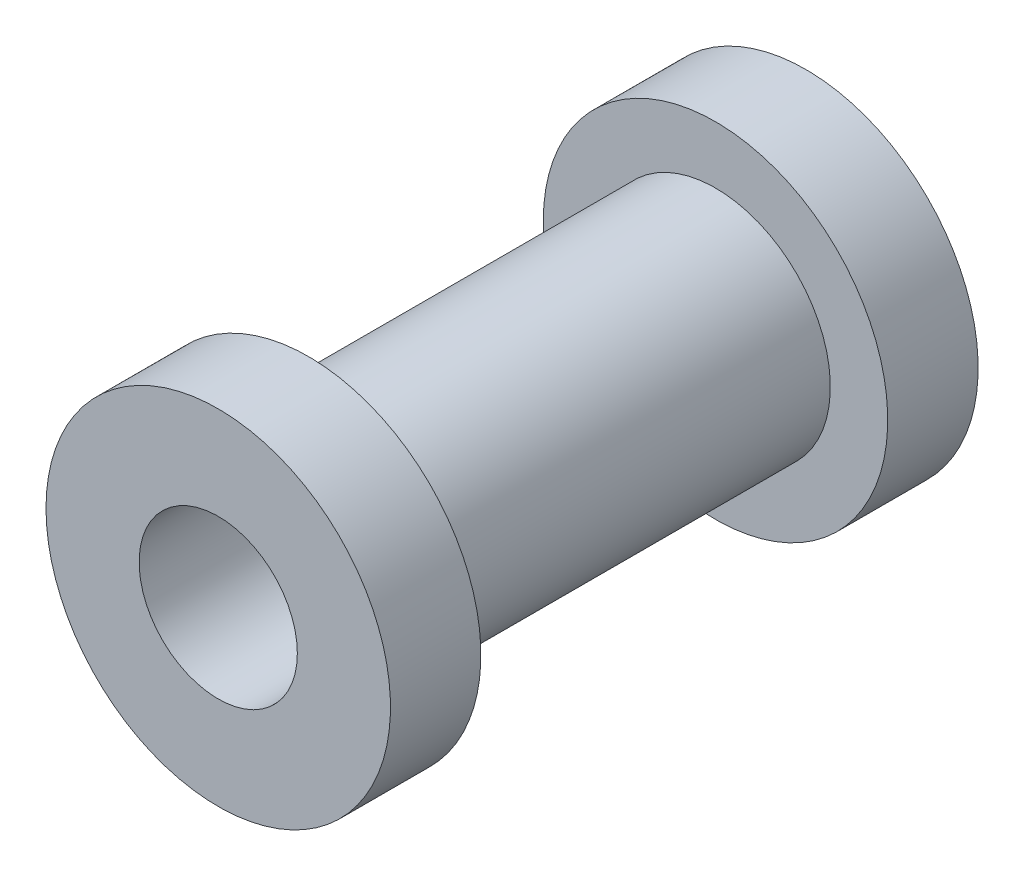
ISO-10303-21;
HEADER;
FILE_DESCRIPTION(('STEP AP214'),'2;1');
FILE_NAME('part.step','',(''),(''),'','','');
FILE_SCHEMA(('AUTOMOTIVE_DESIGN { 1 0 10303 214 1 1 1 1 }'));
ENDSEC;
DATA;
#1=APPLICATION_CONTEXT('core data for automotive mechanical design processes');
#2=APPLICATION_PROTOCOL_DEFINITION('international standard','automotive_design',2000,#1);
#3=PRODUCT_CONTEXT('',#1,'mechanical');
#4=PRODUCT('Part','Part','',(#3));
#5=PRODUCT_RELATED_PRODUCT_CATEGORY('part','',(#4));
#6=PRODUCT_DEFINITION_FORMATION('','',#4);
#7=PRODUCT_DEFINITION_CONTEXT('part definition',#1,'design');
#8=PRODUCT_DEFINITION('design','',#6,#7);
#9=PRODUCT_DEFINITION_SHAPE('','',#8);
#10=(LENGTH_UNIT() NAMED_UNIT(*) SI_UNIT(.MILLI.,.METRE.));
#11=(NAMED_UNIT(*) PLANE_ANGLE_UNIT() SI_UNIT($,.RADIAN.));
#12=(NAMED_UNIT(*) SI_UNIT($,.STERADIAN.) SOLID_ANGLE_UNIT());
#13=UNCERTAINTY_MEASURE_WITH_UNIT(LENGTH_MEASURE(1.E-05),#10,'distance_accuracy_value','');
#14=(GEOMETRIC_REPRESENTATION_CONTEXT(3) GLOBAL_UNCERTAINTY_ASSIGNED_CONTEXT((#13)) GLOBAL_UNIT_ASSIGNED_CONTEXT((#10,
#11,#12)) REPRESENTATION_CONTEXT('',''));
#15=CARTESIAN_POINT('',(0.,0.,0.));
#16=DIRECTION('',(0.,0.,1.));
#17=DIRECTION('',(1.,0.,0.));
#18=AXIS2_PLACEMENT_3D('',#15,#16,#17);
#19=CARTESIAN_POINT('',(0.,0.,65.));
#20=DIRECTION('',(0.,0.,-1.));
#21=DIRECTION('',(-1.,0.,0.));
#22=AXIS2_PLACEMENT_3D('',#19,#20,#21);
#23=CYLINDRICAL_SURFACE('',#22,25.4);
#24=CARTESIAN_POINT('',(0.,0.,-45.));
#25=DIRECTION('',(0.,0.,-1.));
#26=DIRECTION('',(-1.,0.,0.));
#27=AXIS2_PLACEMENT_3D('',#24,#25,#26);
#28=CIRCLE('',#27,25.4);
#29=CARTESIAN_POINT('',(-25.4,0.,-45.));
#30=VERTEX_POINT('',#29);
#31=EDGE_CURVE('E43',#30,#30,#28,.T.);
#32=ORIENTED_EDGE('',*,*,#31,.F.);
#33=EDGE_LOOP('',(#32));
#34=FACE_BOUND('',#33,.T.);
#35=CARTESIAN_POINT('',(0.,0.,45.));
#36=DIRECTION('',(0.,0.,1.));
#37=DIRECTION('',(1.,0.,0.));
#38=AXIS2_PLACEMENT_3D('',#35,#36,#37);
#39=CIRCLE('',#38,25.4);
#40=CARTESIAN_POINT('',(25.4,0.,45.));
#41=VERTEX_POINT('',#40);
#42=EDGE_CURVE('E10',#41,#41,#39,.T.);
#43=ORIENTED_EDGE('',*,*,#42,.F.);
#44=EDGE_LOOP('',(#43));
#45=FACE_BOUND('',#44,.T.);
#46=ADVANCED_FACE('F37',(#34,#45),#23,.T.);
#47=CARTESIAN_POINT('',(0.,0.,65.));
#48=DIRECTION('',(0.,0.,1.));
#49=DIRECTION('',(1.,0.,0.));
#50=AXIS2_PLACEMENT_3D('',#47,#48,#49);
#51=PLANE('',#50);
#52=CARTESIAN_POINT('',(0.,0.,65.));
#53=DIRECTION('',(0.,0.,1.));
#54=DIRECTION('',(1.,0.,0.));
#55=AXIS2_PLACEMENT_3D('',#52,#53,#54);
#56=CIRCLE('',#55,17.5);
#57=CARTESIAN_POINT('',(17.5,0.,65.));
#58=VERTEX_POINT('',#57);
#59=EDGE_CURVE('E47',#58,#58,#56,.T.);
#60=ORIENTED_EDGE('',*,*,#59,.F.);
#61=EDGE_LOOP('',(#60));
#62=FACE_BOUND('',#61,.T.);
#63=CARTESIAN_POINT('',(0.,0.,65.));
#64=DIRECTION('',(0.,0.,-1.));
#65=DIRECTION('',(-1.,0.,0.));
#66=AXIS2_PLACEMENT_3D('',#63,#64,#65);
#67=CIRCLE('',#66,38.1);
#68=CARTESIAN_POINT('',(-38.1,0.,65.));
#69=VERTEX_POINT('',#68);
#70=EDGE_CURVE('E63',#69,#69,#67,.T.);
#71=ORIENTED_EDGE('',*,*,#70,.F.);
#72=EDGE_LOOP('',(#71));
#73=FACE_BOUND('',#72,.T.);
#74=ADVANCED_FACE('F77',(#62,#73),#51,.T.);
#75=CARTESIAN_POINT('',(0.,0.,-65.));
#76=DIRECTION('',(0.,0.,1.));
#77=DIRECTION('',(1.,0.,0.));
#78=AXIS2_PLACEMENT_3D('',#75,#76,#77);
#79=PLANE('',#78);
#80=CARTESIAN_POINT('',(0.,0.,-65.));
#81=DIRECTION('',(0.,0.,1.));
#82=DIRECTION('',(1.,0.,0.));
#83=AXIS2_PLACEMENT_3D('',#80,#81,#82);
#84=CIRCLE('',#83,17.5);
#85=CARTESIAN_POINT('',(17.5,0.,-65.));
#86=VERTEX_POINT('',#85);
#87=EDGE_CURVE('E51',#86,#86,#84,.T.);
#88=ORIENTED_EDGE('',*,*,#87,.T.);
#89=EDGE_LOOP('',(#88));
#90=FACE_BOUND('',#89,.T.);
#91=CARTESIAN_POINT('',(0.,0.,-65.));
#92=DIRECTION('',(0.,0.,-1.));
#93=DIRECTION('',(-1.,0.,0.));
#94=AXIS2_PLACEMENT_3D('',#91,#92,#93);
#95=CIRCLE('',#94,38.1);
#96=CARTESIAN_POINT('',(-38.1,0.,-65.));
#97=VERTEX_POINT('',#96);
#98=EDGE_CURVE('E57',#97,#97,#95,.T.);
#99=ORIENTED_EDGE('',*,*,#98,.T.);
#100=EDGE_LOOP('',(#99));
#101=FACE_BOUND('',#100,.T.);
#102=ADVANCED_FACE('F79',(#90,#101),#79,.F.);
#103=CARTESIAN_POINT('',(0.,0.,65.));
#104=DIRECTION('',(0.,0.,-1.));
#105=DIRECTION('',(-1.,0.,0.));
#106=AXIS2_PLACEMENT_3D('',#103,#104,#105);
#107=CYLINDRICAL_SURFACE('',#106,17.5);
#108=ORIENTED_EDGE('',*,*,#59,.T.);
#109=EDGE_LOOP('',(#108));
#110=FACE_BOUND('',#109,.T.);
#111=ORIENTED_EDGE('',*,*,#87,.F.);
#112=EDGE_LOOP('',(#111));
#113=FACE_BOUND('',#112,.T.);
#114=ADVANCED_FACE('F86',(#110,#113),#107,.F.);
#115=CARTESIAN_POINT('',(0.,0.,-45.));
#116=DIRECTION('',(0.,0.,-1.));
#117=DIRECTION('',(-1.,0.,0.));
#118=AXIS2_PLACEMENT_3D('',#115,#116,#117);
#119=CYLINDRICAL_SURFACE('',#118,38.1);
#120=CARTESIAN_POINT('',(0.,0.,-45.));
#121=DIRECTION('',(0.,0.,-1.));
#122=DIRECTION('',(-1.,0.,0.));
#123=AXIS2_PLACEMENT_3D('',#120,#121,#122);
#124=CIRCLE('',#123,38.1);
#125=CARTESIAN_POINT('',(-38.1,0.,-45.));
#126=VERTEX_POINT('',#125);
#127=EDGE_CURVE('E55',#126,#126,#124,.T.);
#128=ORIENTED_EDGE('',*,*,#127,.T.);
#129=EDGE_LOOP('',(#128));
#130=FACE_BOUND('',#129,.T.);
#131=ORIENTED_EDGE('',*,*,#98,.F.);
#132=EDGE_LOOP('',(#131));
#133=FACE_BOUND('',#132,.T.);
#134=ADVANCED_FACE('F93',(#130,#133),#119,.T.);
#135=CARTESIAN_POINT('',(0.,0.,-45.));
#136=DIRECTION('',(0.,0.,-1.));
#137=DIRECTION('',(-1.,0.,0.));
#138=AXIS2_PLACEMENT_3D('',#135,#136,#137);
#139=PLANE('',#138);
#140=ORIENTED_EDGE('',*,*,#31,.T.);
#141=EDGE_LOOP('',(#140));
#142=FACE_BOUND('',#141,.T.);
#143=ORIENTED_EDGE('',*,*,#127,.F.);
#144=EDGE_LOOP('',(#143));
#145=FACE_BOUND('',#144,.T.);
#146=ADVANCED_FACE('F97',(#142,#145),#139,.F.);
#147=CARTESIAN_POINT('',(0.,0.,45.));
#148=DIRECTION('',(0.,0.,1.));
#149=DIRECTION('',(-1.,0.,0.));
#150=AXIS2_PLACEMENT_3D('',#147,#148,#149);
#151=PLANE('',#150);
#152=CARTESIAN_POINT('',(0.,0.,45.));
#153=DIRECTION('',(0.,0.,-1.));
#154=DIRECTION('',(-1.,0.,0.));
#155=AXIS2_PLACEMENT_3D('',#152,#153,#154);
#156=CIRCLE('',#155,38.1);
#157=CARTESIAN_POINT('',(-38.1,0.,45.));
#158=VERTEX_POINT('',#157);
#159=EDGE_CURVE('E60',#158,#158,#156,.T.);
#160=ORIENTED_EDGE('',*,*,#159,.T.);
#161=EDGE_LOOP('',(#160));
#162=FACE_BOUND('',#161,.T.);
#163=ORIENTED_EDGE('',*,*,#42,.T.);
#164=EDGE_LOOP('',(#163));
#165=FACE_BOUND('',#164,.T.);
#166=ADVANCED_FACE('F69',(#162,#165),#151,.F.);
#167=CARTESIAN_POINT('',(0.,0.,45.));
#168=DIRECTION('',(0.,0.,1.));
#169=DIRECTION('',(1.,0.,0.));
#170=AXIS2_PLACEMENT_3D('',#167,#168,#169);
#171=CYLINDRICAL_SURFACE('',#170,38.1);
#172=ORIENTED_EDGE('',*,*,#159,.F.);
#173=EDGE_LOOP('',(#172));
#174=FACE_BOUND('',#173,.T.);
#175=ORIENTED_EDGE('',*,*,#70,.T.);
#176=EDGE_LOOP('',(#175));
#177=FACE_BOUND('',#176,.T.);
#178=ADVANCED_FACE('F71',(#174,#177),#171,.T.);
#179=CLOSED_SHELL('',(#46,#74,#102,#114,#134,#146,#166,#178));
#180=MANIFOLD_SOLID_BREP('B2',#179);
#181=ADVANCED_BREP_SHAPE_REPRESENTATION('',(#18,#180),#14);
#182=SHAPE_DEFINITION_REPRESENTATION(#9,#181);
ENDSEC;
END-ISO-10303-21;
